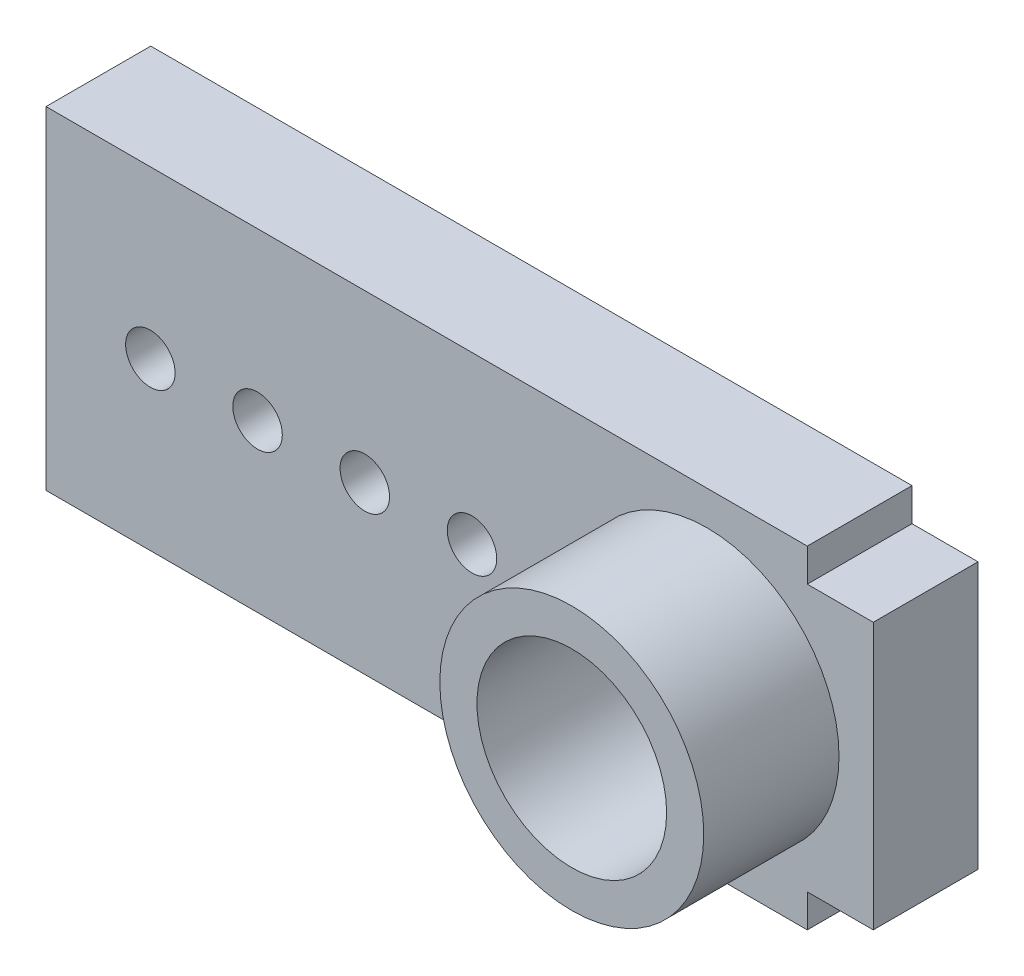
ISO-10303-21;
HEADER;
FILE_DESCRIPTION(('STEP AP214'),'2;1');
FILE_NAME('part.step','',(''),(''),'','','');
FILE_SCHEMA(('AUTOMOTIVE_DESIGN { 1 0 10303 214 1 1 1 1 }'));
ENDSEC;
DATA;
#1=APPLICATION_CONTEXT('core data for automotive mechanical design processes');
#2=APPLICATION_PROTOCOL_DEFINITION('international standard','automotive_design',2000,#1);
#3=PRODUCT_CONTEXT('',#1,'mechanical');
#4=PRODUCT('Part','Part','',(#3));
#5=PRODUCT_RELATED_PRODUCT_CATEGORY('part','',(#4));
#6=PRODUCT_DEFINITION_FORMATION('','',#4);
#7=PRODUCT_DEFINITION_CONTEXT('part definition',#1,'design');
#8=PRODUCT_DEFINITION('design','',#6,#7);
#9=PRODUCT_DEFINITION_SHAPE('','',#8);
#10=(LENGTH_UNIT() NAMED_UNIT(*) SI_UNIT(.MILLI.,.METRE.));
#11=(NAMED_UNIT(*) PLANE_ANGLE_UNIT() SI_UNIT($,.RADIAN.));
#12=(NAMED_UNIT(*) SI_UNIT($,.STERADIAN.) SOLID_ANGLE_UNIT());
#13=UNCERTAINTY_MEASURE_WITH_UNIT(LENGTH_MEASURE(1.E-05),#10,'distance_accuracy_value','');
#14=(GEOMETRIC_REPRESENTATION_CONTEXT(3) GLOBAL_UNCERTAINTY_ASSIGNED_CONTEXT((#13)) GLOBAL_UNIT_ASSIGNED_CONTEXT((#10,
#11,#12)) REPRESENTATION_CONTEXT('',''));
#15=CARTESIAN_POINT('',(0.,0.,0.));
#16=DIRECTION('',(0.,0.,1.));
#17=DIRECTION('',(1.,0.,0.));
#18=AXIS2_PLACEMENT_3D('',#15,#16,#17);
#19=CARTESIAN_POINT('',(0.,0.,3.175));
#20=DIRECTION('',(0.,0.,1.));
#21=DIRECTION('',(1.,0.,0.));
#22=AXIS2_PLACEMENT_3D('',#19,#20,#21);
#23=PLANE('',#22);
#24=DIRECTION('',(0.,-1.,0.));
#25=VECTOR('',#24,1.);
#26=CARTESIAN_POINT('',(3.03813579770553,0.,3.175));
#27=LINE('',#26,#25);
#28=CARTESIAN_POINT('',(3.03813579770553,5.03813581595416,3.175));
#29=VERTEX_POINT('',#28);
#30=CARTESIAN_POINT('',(3.03813579770553,4.03813581595409,3.175));
#31=VERTEX_POINT('',#30);
#32=EDGE_CURVE('E81',#29,#31,#27,.T.);
#33=ORIENTED_EDGE('',*,*,#32,.F.);
#34=DIRECTION('',(-1.,0.,0.));
#35=VECTOR('',#34,1.);
#36=CARTESIAN_POINT('',(-20.0381358159541,5.03813581595435,3.175));
#37=LINE('',#36,#35);
#38=CARTESIAN_POINT('',(-20.0381358159541,5.03813581595435,3.175));
#39=VERTEX_POINT('',#38);
#40=EDGE_CURVE('E121',#29,#39,#37,.T.);
#41=ORIENTED_EDGE('',*,*,#40,.T.);
#42=DIRECTION('',(0.,-1.,0.));
#43=VECTOR('',#42,1.);
#44=CARTESIAN_POINT('',(-20.0381358159542,-5.03813581595393,3.175));
#45=LINE('',#44,#43);
#46=CARTESIAN_POINT('',(-20.0381358159542,-5.03813581595393,3.175));
#47=VERTEX_POINT('',#46);
#48=EDGE_CURVE('E63',#39,#47,#45,.T.);
#49=ORIENTED_EDGE('',*,*,#48,.T.);
#50=DIRECTION('',(1.,0.,0.));
#51=VECTOR('',#50,1.);
#52=CARTESIAN_POINT('',(-5.03813581595418,-5.03813581595413,3.175));
#53=LINE('',#52,#51);
#54=CARTESIAN_POINT('',(3.03813579770553,-5.03813581595416,3.175));
#55=VERTEX_POINT('',#54);
#56=EDGE_CURVE('E208',#47,#55,#53,.T.);
#57=ORIENTED_EDGE('',*,*,#56,.T.);
#58=DIRECTION('',(0.,-1.,0.));
#59=VECTOR('',#58,1.);
#60=CARTESIAN_POINT('',(3.03813579770553,0.,3.175));
#61=LINE('',#60,#59);
#62=CARTESIAN_POINT('',(3.03813579770553,-4.03813581595409,3.175));
#63=VERTEX_POINT('',#62);
#64=EDGE_CURVE('E131',#63,#55,#61,.T.);
#65=ORIENTED_EDGE('',*,*,#64,.F.);
#66=DIRECTION('',(-1.,0.,0.));
#67=VECTOR('',#66,1.);
#68=CARTESIAN_POINT('',(0.,-4.03813581595409,3.175));
#69=LINE('',#68,#67);
#70=CARTESIAN_POINT('',(5.03813579770548,-4.03813581595409,3.175));
#71=VERTEX_POINT('',#70);
#72=EDGE_CURVE('E162',#71,#63,#69,.T.);
#73=ORIENTED_EDGE('',*,*,#72,.F.);
#74=DIRECTION('',(0.,-1.,0.));
#75=VECTOR('',#74,1.);
#76=CARTESIAN_POINT('',(5.0381357977055,0.,3.175));
#77=LINE('',#76,#75);
#78=CARTESIAN_POINT('',(5.03813579770553,4.03813581595416,3.175));
#79=VERTEX_POINT('',#78);
#80=EDGE_CURVE('E164',#79,#71,#77,.T.);
#81=ORIENTED_EDGE('',*,*,#80,.F.);
#82=DIRECTION('',(1.,0.,0.));
#83=VECTOR('',#82,1.);
#84=CARTESIAN_POINT('',(-1.40100979982363E-13,4.03813581595398,3.175));
#85=LINE('',#84,#83);
#86=EDGE_CURVE('E166',#31,#79,#85,.T.);
#87=ORIENTED_EDGE('',*,*,#86,.F.);
#88=EDGE_LOOP('',(#33,#41,#49,#57,#65,#73,#81,#87));
#89=FACE_BOUND('',#88,.T.);
#90=CARTESIAN_POINT('',(-16.875,1.77031031709753E-13,3.175));
#91=DIRECTION('',(0.,0.,1.));
#92=DIRECTION('',(1.,0.,0.));
#93=AXIS2_PLACEMENT_3D('',#90,#91,#92);
#94=CIRCLE('',#93,0.75);
#95=CARTESIAN_POINT('',(-16.125,1.77031031709753E-13,3.175));
#96=VERTEX_POINT('',#95);
#97=EDGE_CURVE('E179',#96,#96,#94,.T.);
#98=ORIENTED_EDGE('',*,*,#97,.F.);
#99=EDGE_LOOP('',(#98));
#100=FACE_BOUND('',#99,.T.);
#101=CARTESIAN_POINT('',(-10.375,1.08947145602311E-13,3.175));
#102=DIRECTION('',(0.,0.,1.));
#103=DIRECTION('',(1.,0.,0.));
#104=AXIS2_PLACEMENT_3D('',#101,#102,#103);
#105=CIRCLE('',#104,0.75);
#106=CARTESIAN_POINT('',(-9.625,1.08947145602311E-13,3.175));
#107=VERTEX_POINT('',#106);
#108=EDGE_CURVE('E191',#107,#107,#105,.T.);
#109=ORIENTED_EDGE('',*,*,#108,.F.);
#110=EDGE_LOOP('',(#109));
#111=FACE_BOUND('',#110,.T.);
#112=CARTESIAN_POINT('',(-7.125,0.,3.175));
#113=DIRECTION('',(0.,0.,1.));
#114=DIRECTION('',(1.,0.,0.));
#115=AXIS2_PLACEMENT_3D('',#112,#113,#114);
#116=CIRCLE('',#115,0.75);
#117=CARTESIAN_POINT('',(-6.375,0.,3.175));
#118=VERTEX_POINT('',#117);
#119=EDGE_CURVE('E197',#118,#118,#116,.T.);
#120=ORIENTED_EDGE('',*,*,#119,.F.);
#121=EDGE_LOOP('',(#120));
#122=FACE_BOUND('',#121,.T.);
#123=CARTESIAN_POINT('',(-13.625,1.42989088656032E-13,3.175));
#124=DIRECTION('',(0.,0.,1.));
#125=DIRECTION('',(1.,0.,0.));
#126=AXIS2_PLACEMENT_3D('',#123,#124,#125);
#127=CIRCLE('',#126,0.75);
#128=CARTESIAN_POINT('',(-12.875,1.42989088656032E-13,3.175));
#129=VERTEX_POINT('',#128);
#130=EDGE_CURVE('E185',#129,#129,#127,.T.);
#131=ORIENTED_EDGE('',*,*,#130,.F.);
#132=EDGE_LOOP('',(#131));
#133=FACE_BOUND('',#132,.T.);
#134=CARTESIAN_POINT('',(0.,0.,3.175));
#135=DIRECTION('',(0.,0.,1.));
#136=DIRECTION('',(1.,0.,0.));
#137=AXIS2_PLACEMENT_3D('',#134,#135,#136);
#138=CIRCLE('',#137,4.);
#139=CARTESIAN_POINT('',(4.,0.,3.175));
#140=VERTEX_POINT('',#139);
#141=EDGE_CURVE('E172',#140,#140,#138,.T.);
#142=ORIENTED_EDGE('',*,*,#141,.F.);
#143=EDGE_LOOP('',(#142));
#144=FACE_BOUND('',#143,.T.);
#145=ADVANCED_FACE('F46',(#89,#100,#111,#122,#133,#144),#23,.T.);
#146=CARTESIAN_POINT('',(0.,0.,0.));
#147=DIRECTION('',(0.,0.,1.));
#148=DIRECTION('',(1.,0.,0.));
#149=AXIS2_PLACEMENT_3D('',#146,#147,#148);
#150=PLANE('',#149);
#151=CARTESIAN_POINT('',(-13.625,1.42989088656032E-13,0.));
#152=DIRECTION('',(0.,0.,1.));
#153=DIRECTION('',(1.,0.,0.));
#154=AXIS2_PLACEMENT_3D('',#151,#152,#153);
#155=CIRCLE('',#154,0.75);
#156=CARTESIAN_POINT('',(-12.875,1.42989088656032E-13,0.));
#157=VERTEX_POINT('',#156);
#158=EDGE_CURVE('E182',#157,#157,#155,.T.);
#159=ORIENTED_EDGE('',*,*,#158,.T.);
#160=EDGE_LOOP('',(#159));
#161=FACE_BOUND('',#160,.T.);
#162=CARTESIAN_POINT('',(-7.125,0.,0.));
#163=DIRECTION('',(0.,0.,1.));
#164=DIRECTION('',(1.,0.,0.));
#165=AXIS2_PLACEMENT_3D('',#162,#163,#164);
#166=CIRCLE('',#165,0.75);
#167=CARTESIAN_POINT('',(-6.375,0.,0.));
#168=VERTEX_POINT('',#167);
#169=EDGE_CURVE('E194',#168,#168,#166,.T.);
#170=ORIENTED_EDGE('',*,*,#169,.T.);
#171=EDGE_LOOP('',(#170));
#172=FACE_BOUND('',#171,.T.);
#173=DIRECTION('',(-1.,0.,0.));
#174=VECTOR('',#173,1.);
#175=CARTESIAN_POINT('',(-20.0381358159541,5.03813581595435,0.));
#176=LINE('',#175,#174);
#177=CARTESIAN_POINT('',(3.03813579770553,5.03813581595416,0.));
#178=VERTEX_POINT('',#177);
#179=CARTESIAN_POINT('',(-20.0381358159541,5.03813581595435,0.));
#180=VERTEX_POINT('',#179);
#181=EDGE_CURVE('E205',#178,#180,#176,.T.);
#182=ORIENTED_EDGE('',*,*,#181,.F.);
#183=DIRECTION('',(0.,1.,0.));
#184=VECTOR('',#183,1.);
#185=CARTESIAN_POINT('',(3.03813579770553,4.03813581595409,0.));
#186=LINE('',#185,#184);
#187=CARTESIAN_POINT('',(3.03813579770553,4.03813581595409,0.));
#188=VERTEX_POINT('',#187);
#189=EDGE_CURVE('E133',#188,#178,#186,.T.);
#190=ORIENTED_EDGE('',*,*,#189,.F.);
#191=DIRECTION('',(-1.,0.,0.));
#192=VECTOR('',#191,1.);
#193=CARTESIAN_POINT('',(5.03813579770553,4.03813581595416,0.));
#194=LINE('',#193,#192);
#195=CARTESIAN_POINT('',(5.03813579770553,4.03813581595416,0.));
#196=VERTEX_POINT('',#195);
#197=EDGE_CURVE('E146',#196,#188,#194,.T.);
#198=ORIENTED_EDGE('',*,*,#197,.F.);
#199=DIRECTION('',(0.,1.,0.));
#200=VECTOR('',#199,1.);
#201=CARTESIAN_POINT('',(5.03813579770553,4.03813581595416,0.));
#202=LINE('',#201,#200);
#203=CARTESIAN_POINT('',(5.03813579770548,-4.03813581595409,0.));
#204=VERTEX_POINT('',#203);
#205=EDGE_CURVE('E141',#204,#196,#202,.T.);
#206=ORIENTED_EDGE('',*,*,#205,.F.);
#207=DIRECTION('',(1.,0.,0.));
#208=VECTOR('',#207,1.);
#209=CARTESIAN_POINT('',(5.03813579770548,-4.03813581595409,0.));
#210=LINE('',#209,#208);
#211=CARTESIAN_POINT('',(3.03813579770553,-4.03813581595409,0.));
#212=VERTEX_POINT('',#211);
#213=EDGE_CURVE('E139',#212,#204,#210,.T.);
#214=ORIENTED_EDGE('',*,*,#213,.F.);
#215=DIRECTION('',(0.,1.,0.));
#216=VECTOR('',#215,1.);
#217=CARTESIAN_POINT('',(3.03813579770553,-4.03813581595409,0.));
#218=LINE('',#217,#216);
#219=CARTESIAN_POINT('',(3.03813579770553,-5.03813581595416,0.));
#220=VERTEX_POINT('',#219);
#221=EDGE_CURVE('E128',#220,#212,#218,.T.);
#222=ORIENTED_EDGE('',*,*,#221,.F.);
#223=DIRECTION('',(1.,0.,0.));
#224=VECTOR('',#223,1.);
#225=CARTESIAN_POINT('',(-5.03813581595418,-5.03813581595413,0.));
#226=LINE('',#225,#224);
#227=CARTESIAN_POINT('',(-20.0381358159542,-5.03813581595393,0.));
#228=VERTEX_POINT('',#227);
#229=EDGE_CURVE('E115',#228,#220,#226,.T.);
#230=ORIENTED_EDGE('',*,*,#229,.F.);
#231=DIRECTION('',(0.,-1.,0.));
#232=VECTOR('',#231,1.);
#233=CARTESIAN_POINT('',(-20.0381358159542,-5.03813581595393,0.));
#234=LINE('',#233,#232);
#235=EDGE_CURVE('E74',#180,#228,#234,.T.);
#236=ORIENTED_EDGE('',*,*,#235,.F.);
#237=EDGE_LOOP('',(#182,#190,#198,#206,#214,#222,#230,#236));
#238=FACE_BOUND('',#237,.T.);
#239=CARTESIAN_POINT('',(0.,0.,0.));
#240=DIRECTION('',(0.,0.,1.));
#241=DIRECTION('',(1.,0.,0.));
#242=AXIS2_PLACEMENT_3D('',#239,#240,#241);
#243=CIRCLE('',#242,2.875);
#244=CARTESIAN_POINT('',(2.875,0.,0.));
#245=VERTEX_POINT('',#244);
#246=EDGE_CURVE('E200',#245,#245,#243,.T.);
#247=ORIENTED_EDGE('',*,*,#246,.T.);
#248=EDGE_LOOP('',(#247));
#249=FACE_BOUND('',#248,.T.);
#250=CARTESIAN_POINT('',(-10.375,1.08947145602311E-13,0.));
#251=DIRECTION('',(0.,0.,1.));
#252=DIRECTION('',(1.,0.,0.));
#253=AXIS2_PLACEMENT_3D('',#250,#251,#252);
#254=CIRCLE('',#253,0.75);
#255=CARTESIAN_POINT('',(-9.625,1.08947145602311E-13,0.));
#256=VERTEX_POINT('',#255);
#257=EDGE_CURVE('E188',#256,#256,#254,.T.);
#258=ORIENTED_EDGE('',*,*,#257,.T.);
#259=EDGE_LOOP('',(#258));
#260=FACE_BOUND('',#259,.T.);
#261=CARTESIAN_POINT('',(-16.875,1.77031031709753E-13,0.));
#262=DIRECTION('',(0.,0.,1.));
#263=DIRECTION('',(1.,0.,0.));
#264=AXIS2_PLACEMENT_3D('',#261,#262,#263);
#265=CIRCLE('',#264,0.75);
#266=CARTESIAN_POINT('',(-16.125,1.77031031709753E-13,0.));
#267=VERTEX_POINT('',#266);
#268=EDGE_CURVE('E176',#267,#267,#265,.T.);
#269=ORIENTED_EDGE('',*,*,#268,.T.);
#270=EDGE_LOOP('',(#269));
#271=FACE_BOUND('',#270,.T.);
#272=ADVANCED_FACE('F135',(#161,#172,#238,#249,#260,#271),#150,.F.);
#273=CARTESIAN_POINT('',(-20.0381358159541,5.03813581595435,3.175));
#274=DIRECTION('',(0.,-1.,0.));
#275=DIRECTION('',(1.,0.,0.));
#276=AXIS2_PLACEMENT_3D('',#273,#274,#275);
#277=PLANE('',#276);
#278=ORIENTED_EDGE('',*,*,#181,.T.);
#279=DIRECTION('',(0.,0.,-1.));
#280=VECTOR('',#279,1.);
#281=CARTESIAN_POINT('',(-20.0381358159541,5.03813581595435,3.175));
#282=LINE('',#281,#280);
#283=EDGE_CURVE('E13',#39,#180,#282,.T.);
#284=ORIENTED_EDGE('',*,*,#283,.F.);
#285=ORIENTED_EDGE('',*,*,#40,.F.);
#286=DIRECTION('',(0.,0.,-1.));
#287=VECTOR('',#286,1.);
#288=CARTESIAN_POINT('',(3.03813579770553,5.03813581595416,7.275));
#289=LINE('',#288,#287);
#290=EDGE_CURVE('E151',#29,#178,#289,.T.);
#291=ORIENTED_EDGE('',*,*,#290,.T.);
#292=EDGE_LOOP('',(#278,#284,#285,#291));
#293=FACE_BOUND('',#292,.T.);
#294=ADVANCED_FACE('F48',(#293),#277,.F.);
#295=CARTESIAN_POINT('',(-20.0381358159542,-5.03813581595393,3.175));
#296=DIRECTION('',(1.,0.,0.));
#297=DIRECTION('',(0.,1.,0.));
#298=AXIS2_PLACEMENT_3D('',#295,#296,#297);
#299=PLANE('',#298);
#300=ORIENTED_EDGE('',*,*,#235,.T.);
#301=DIRECTION('',(0.,0.,-1.));
#302=VECTOR('',#301,1.);
#303=CARTESIAN_POINT('',(-20.0381358159542,-5.03813581595393,3.175));
#304=LINE('',#303,#302);
#305=EDGE_CURVE('E55',#47,#228,#304,.T.);
#306=ORIENTED_EDGE('',*,*,#305,.F.);
#307=ORIENTED_EDGE('',*,*,#48,.F.);
#308=ORIENTED_EDGE('',*,*,#283,.T.);
#309=EDGE_LOOP('',(#300,#306,#307,#308));
#310=FACE_BOUND('',#309,.T.);
#311=ADVANCED_FACE('F213',(#310),#299,.F.);
#312=CARTESIAN_POINT('',(-5.03813581595418,-5.03813581595413,3.175));
#313=DIRECTION('',(0.,1.,0.));
#314=DIRECTION('',(-1.,0.,0.));
#315=AXIS2_PLACEMENT_3D('',#312,#313,#314);
#316=PLANE('',#315);
#317=ORIENTED_EDGE('',*,*,#229,.T.);
#318=DIRECTION('',(0.,0.,-1.));
#319=VECTOR('',#318,1.);
#320=CARTESIAN_POINT('',(3.03813579770553,-5.03813581595416,7.275));
#321=LINE('',#320,#319);
#322=EDGE_CURVE('E119',#55,#220,#321,.T.);
#323=ORIENTED_EDGE('',*,*,#322,.F.);
#324=ORIENTED_EDGE('',*,*,#56,.F.);
#325=ORIENTED_EDGE('',*,*,#305,.T.);
#326=EDGE_LOOP('',(#317,#323,#324,#325));
#327=FACE_BOUND('',#326,.T.);
#328=ADVANCED_FACE('F117',(#327),#316,.F.);
#329=CARTESIAN_POINT('',(0.,0.,3.175));
#330=DIRECTION('',(0.,0.,-1.));
#331=DIRECTION('',(-1.,0.,0.));
#332=AXIS2_PLACEMENT_3D('',#329,#330,#331);
#333=CYLINDRICAL_SURFACE('',#332,2.875);
#334=ORIENTED_EDGE('',*,*,#246,.F.);
#335=EDGE_LOOP('',(#334));
#336=FACE_BOUND('',#335,.T.);
#337=CARTESIAN_POINT('',(0.,0.,7.275));
#338=DIRECTION('',(0.,0.,1.));
#339=DIRECTION('',(1.,0.,0.));
#340=AXIS2_PLACEMENT_3D('',#337,#338,#339);
#341=CIRCLE('',#340,2.875);
#342=CARTESIAN_POINT('',(2.875,0.,7.275));
#343=VERTEX_POINT('',#342);
#344=EDGE_CURVE('E169',#343,#343,#341,.T.);
#345=ORIENTED_EDGE('',*,*,#344,.T.);
#346=EDGE_LOOP('',(#345));
#347=FACE_BOUND('',#346,.T.);
#348=ADVANCED_FACE('F273',(#336,#347),#333,.F.);
#349=CARTESIAN_POINT('',(-7.125,0.,3.175));
#350=DIRECTION('',(0.,0.,-1.));
#351=DIRECTION('',(-1.,0.,0.));
#352=AXIS2_PLACEMENT_3D('',#349,#350,#351);
#353=CYLINDRICAL_SURFACE('',#352,0.75);
#354=ORIENTED_EDGE('',*,*,#119,.T.);
#355=EDGE_LOOP('',(#354));
#356=FACE_BOUND('',#355,.T.);
#357=ORIENTED_EDGE('',*,*,#169,.F.);
#358=EDGE_LOOP('',(#357));
#359=FACE_BOUND('',#358,.T.);
#360=ADVANCED_FACE('F269',(#356,#359),#353,.F.);
#361=CARTESIAN_POINT('',(-10.375,1.08947145602311E-13,3.175));
#362=DIRECTION('',(0.,0.,-1.));
#363=DIRECTION('',(-1.,0.,0.));
#364=AXIS2_PLACEMENT_3D('',#361,#362,#363);
#365=CYLINDRICAL_SURFACE('',#364,0.75);
#366=ORIENTED_EDGE('',*,*,#108,.T.);
#367=EDGE_LOOP('',(#366));
#368=FACE_BOUND('',#367,.T.);
#369=ORIENTED_EDGE('',*,*,#257,.F.);
#370=EDGE_LOOP('',(#369));
#371=FACE_BOUND('',#370,.T.);
#372=ADVANCED_FACE('F265',(#368,#371),#365,.F.);
#373=CARTESIAN_POINT('',(-13.625,1.42989088656032E-13,3.175));
#374=DIRECTION('',(0.,0.,-1.));
#375=DIRECTION('',(-1.,0.,0.));
#376=AXIS2_PLACEMENT_3D('',#373,#374,#375);
#377=CYLINDRICAL_SURFACE('',#376,0.75);
#378=ORIENTED_EDGE('',*,*,#130,.T.);
#379=EDGE_LOOP('',(#378));
#380=FACE_BOUND('',#379,.T.);
#381=ORIENTED_EDGE('',*,*,#158,.F.);
#382=EDGE_LOOP('',(#381));
#383=FACE_BOUND('',#382,.T.);
#384=ADVANCED_FACE('F261',(#380,#383),#377,.F.);
#385=CARTESIAN_POINT('',(-16.875,1.77031031709753E-13,3.175));
#386=DIRECTION('',(0.,0.,-1.));
#387=DIRECTION('',(-1.,0.,0.));
#388=AXIS2_PLACEMENT_3D('',#385,#386,#387);
#389=CYLINDRICAL_SURFACE('',#388,0.75);
#390=ORIENTED_EDGE('',*,*,#97,.T.);
#391=EDGE_LOOP('',(#390));
#392=FACE_BOUND('',#391,.T.);
#393=ORIENTED_EDGE('',*,*,#268,.F.);
#394=EDGE_LOOP('',(#393));
#395=FACE_BOUND('',#394,.T.);
#396=ADVANCED_FACE('F253',(#392,#395),#389,.F.);
#397=CARTESIAN_POINT('',(0.,0.,7.275));
#398=DIRECTION('',(0.,0.,1.));
#399=DIRECTION('',(1.,0.,0.));
#400=AXIS2_PLACEMENT_3D('',#397,#398,#399);
#401=PLANE('',#400);
#402=CARTESIAN_POINT('',(0.,0.,7.275));
#403=DIRECTION('',(0.,0.,1.));
#404=DIRECTION('',(1.,0.,0.));
#405=AXIS2_PLACEMENT_3D('',#402,#403,#404);
#406=CIRCLE('',#405,4.);
#407=CARTESIAN_POINT('',(4.,0.,7.275));
#408=VERTEX_POINT('',#407);
#409=EDGE_CURVE('E173',#408,#408,#406,.T.);
#410=ORIENTED_EDGE('',*,*,#409,.T.);
#411=EDGE_LOOP('',(#410));
#412=FACE_BOUND('',#411,.T.);
#413=ORIENTED_EDGE('',*,*,#344,.F.);
#414=EDGE_LOOP('',(#413));
#415=FACE_BOUND('',#414,.T.);
#416=ADVANCED_FACE('F245',(#412,#415),#401,.T.);
#417=CARTESIAN_POINT('',(0.,0.,7.275));
#418=DIRECTION('',(0.,0.,-1.));
#419=DIRECTION('',(-1.,0.,0.));
#420=AXIS2_PLACEMENT_3D('',#417,#418,#419);
#421=CYLINDRICAL_SURFACE('',#420,4.);
#422=ORIENTED_EDGE('',*,*,#409,.F.);
#423=EDGE_LOOP('',(#422));
#424=FACE_BOUND('',#423,.T.);
#425=ORIENTED_EDGE('',*,*,#141,.T.);
#426=EDGE_LOOP('',(#425));
#427=FACE_BOUND('',#426,.T.);
#428=ADVANCED_FACE('F243',(#424,#427),#421,.T.);
#429=CARTESIAN_POINT('',(3.03813579770553,4.03813581595409,7.275));
#430=DIRECTION('',(-1.,0.,0.));
#431=DIRECTION('',(0.,0.,1.));
#432=AXIS2_PLACEMENT_3D('',#429,#430,#431);
#433=PLANE('',#432);
#434=ORIENTED_EDGE('',*,*,#32,.T.);
#435=DIRECTION('',(0.,0.,-1.));
#436=VECTOR('',#435,1.);
#437=CARTESIAN_POINT('',(3.03813579770553,4.03813581595409,7.275));
#438=LINE('',#437,#436);
#439=EDGE_CURVE('E154',#31,#188,#438,.T.);
#440=ORIENTED_EDGE('',*,*,#439,.T.);
#441=ORIENTED_EDGE('',*,*,#189,.T.);
#442=ORIENTED_EDGE('',*,*,#290,.F.);
#443=EDGE_LOOP('',(#434,#440,#441,#442));
#444=FACE_BOUND('',#443,.T.);
#445=ADVANCED_FACE('F218',(#444),#433,.F.);
#446=CARTESIAN_POINT('',(5.03813579770553,4.03813581595416,7.275));
#447=DIRECTION('',(0.,-1.,0.));
#448=DIRECTION('',(1.,0.,0.));
#449=AXIS2_PLACEMENT_3D('',#446,#447,#448);
#450=PLANE('',#449);
#451=ORIENTED_EDGE('',*,*,#86,.T.);
#452=DIRECTION('',(0.,0.,-1.));
#453=VECTOR('',#452,1.);
#454=CARTESIAN_POINT('',(5.03813579770553,4.03813581595416,7.275));
#455=LINE('',#454,#453);
#456=EDGE_CURVE('E156',#79,#196,#455,.T.);
#457=ORIENTED_EDGE('',*,*,#456,.T.);
#458=ORIENTED_EDGE('',*,*,#197,.T.);
#459=ORIENTED_EDGE('',*,*,#439,.F.);
#460=EDGE_LOOP('',(#451,#457,#458,#459));
#461=FACE_BOUND('',#460,.T.);
#462=ADVANCED_FACE('F221',(#461),#450,.F.);
#463=CARTESIAN_POINT('',(5.03813579770553,4.03813581595416,7.275));
#464=DIRECTION('',(-1.,0.,0.));
#465=DIRECTION('',(0.,-1.,0.));
#466=AXIS2_PLACEMENT_3D('',#463,#464,#465);
#467=PLANE('',#466);
#468=ORIENTED_EDGE('',*,*,#80,.T.);
#469=DIRECTION('',(0.,0.,-1.));
#470=VECTOR('',#469,1.);
#471=CARTESIAN_POINT('',(5.03813579770548,-4.03813581595409,7.275));
#472=LINE('',#471,#470);
#473=EDGE_CURVE('E158',#71,#204,#472,.T.);
#474=ORIENTED_EDGE('',*,*,#473,.T.);
#475=ORIENTED_EDGE('',*,*,#205,.T.);
#476=ORIENTED_EDGE('',*,*,#456,.F.);
#477=EDGE_LOOP('',(#468,#474,#475,#476));
#478=FACE_BOUND('',#477,.T.);
#479=ADVANCED_FACE('F225',(#478),#467,.F.);
#480=CARTESIAN_POINT('',(5.03813579770548,-4.03813581595409,7.275));
#481=DIRECTION('',(0.,1.,0.));
#482=DIRECTION('',(0.,0.,1.));
#483=AXIS2_PLACEMENT_3D('',#480,#481,#482);
#484=PLANE('',#483);
#485=ORIENTED_EDGE('',*,*,#72,.T.);
#486=DIRECTION('',(0.,0.,-1.));
#487=VECTOR('',#486,1.);
#488=CARTESIAN_POINT('',(3.03813579770553,-4.03813581595409,7.275));
#489=LINE('',#488,#487);
#490=EDGE_CURVE('E132',#63,#212,#489,.T.);
#491=ORIENTED_EDGE('',*,*,#490,.T.);
#492=ORIENTED_EDGE('',*,*,#213,.T.);
#493=ORIENTED_EDGE('',*,*,#473,.F.);
#494=EDGE_LOOP('',(#485,#491,#492,#493));
#495=FACE_BOUND('',#494,.T.);
#496=ADVANCED_FACE('F229',(#495),#484,.F.);
#497=CARTESIAN_POINT('',(3.03813579770553,-4.03813581595409,7.275));
#498=DIRECTION('',(-1.,0.,0.));
#499=DIRECTION('',(0.,0.,1.));
#500=AXIS2_PLACEMENT_3D('',#497,#498,#499);
#501=PLANE('',#500);
#502=ORIENTED_EDGE('',*,*,#64,.T.);
#503=ORIENTED_EDGE('',*,*,#322,.T.);
#504=ORIENTED_EDGE('',*,*,#221,.T.);
#505=ORIENTED_EDGE('',*,*,#490,.F.);
#506=EDGE_LOOP('',(#502,#503,#504,#505));
#507=FACE_BOUND('',#506,.T.);
#508=ADVANCED_FACE('F126',(#507),#501,.F.);
#509=CLOSED_SHELL('',(#145,#272,#294,#311,#328,#348,#360,#372,#384,#396,#416,#428,#445,#462,
#479,#496,#508));
#510=MANIFOLD_SOLID_BREP('B2',#509);
#511=ADVANCED_BREP_SHAPE_REPRESENTATION('',(#18,#510),#14);
#512=SHAPE_DEFINITION_REPRESENTATION(#9,#511);
ENDSEC;
END-ISO-10303-21;
